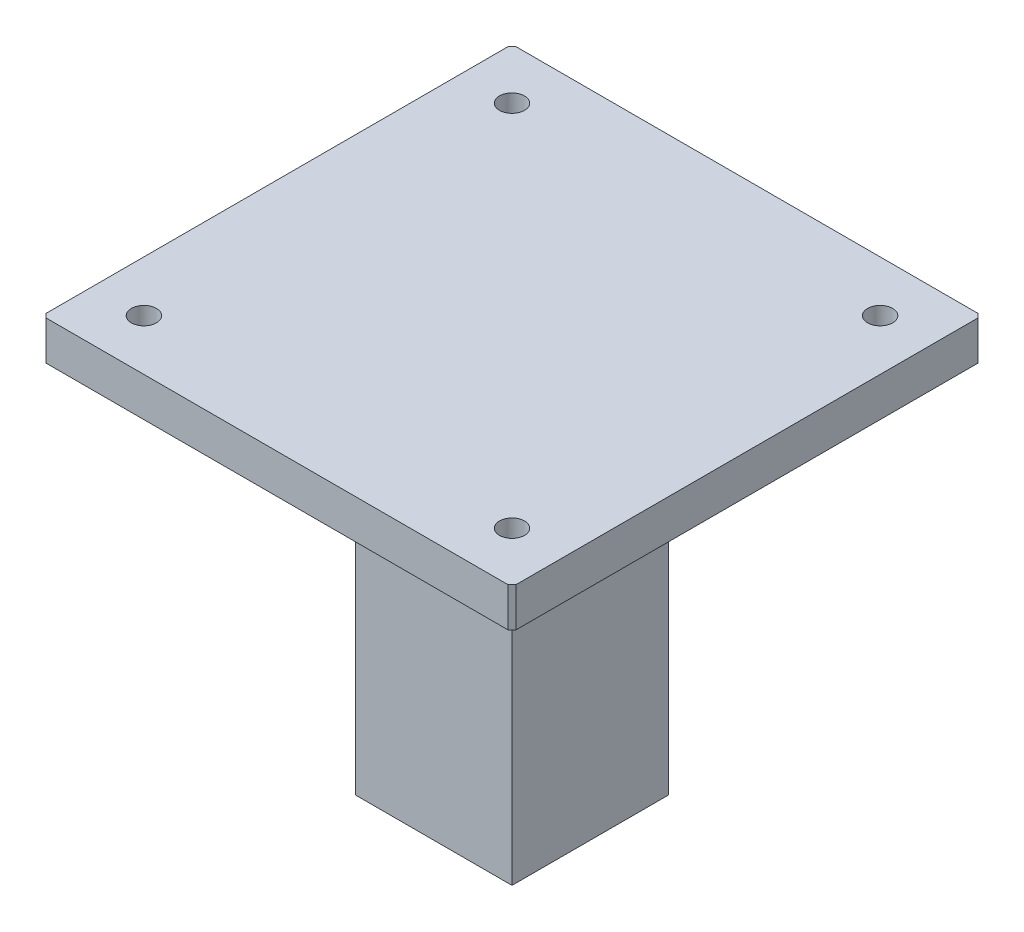
ISO-10303-21;
HEADER;
FILE_DESCRIPTION(('STEP AP214'),'2;1');
FILE_NAME('part.step','',(''),(''),'','','');
FILE_SCHEMA(('AUTOMOTIVE_DESIGN { 1 0 10303 214 1 1 1 1 }'));
ENDSEC;
DATA;
#1=APPLICATION_CONTEXT('core data for automotive mechanical design processes');
#2=APPLICATION_PROTOCOL_DEFINITION('international standard','automotive_design',2000,#1);
#3=PRODUCT_CONTEXT('',#1,'mechanical');
#4=PRODUCT('Part','Part','',(#3));
#5=PRODUCT_RELATED_PRODUCT_CATEGORY('part','',(#4));
#6=PRODUCT_DEFINITION_FORMATION('','',#4);
#7=PRODUCT_DEFINITION_CONTEXT('part definition',#1,'design');
#8=PRODUCT_DEFINITION('design','',#6,#7);
#9=PRODUCT_DEFINITION_SHAPE('','',#8);
#10=(LENGTH_UNIT() NAMED_UNIT(*) SI_UNIT(.MILLI.,.METRE.));
#11=(NAMED_UNIT(*) PLANE_ANGLE_UNIT() SI_UNIT($,.RADIAN.));
#12=(NAMED_UNIT(*) SI_UNIT($,.STERADIAN.) SOLID_ANGLE_UNIT());
#13=UNCERTAINTY_MEASURE_WITH_UNIT(LENGTH_MEASURE(1.E-05),#10,'distance_accuracy_value','');
#14=(GEOMETRIC_REPRESENTATION_CONTEXT(3) GLOBAL_UNCERTAINTY_ASSIGNED_CONTEXT((#13)) GLOBAL_UNIT_ASSIGNED_CONTEXT((#10,
#11,#12)) REPRESENTATION_CONTEXT('',''));
#15=CARTESIAN_POINT('',(0.,0.,0.));
#16=DIRECTION('',(0.,0.,1.));
#17=DIRECTION('',(1.,0.,0.));
#18=AXIS2_PLACEMENT_3D('',#15,#16,#17);
#19=CARTESIAN_POINT('',(0.,0.,0.));
#20=DIRECTION('',(0.,-1.,0.));
#21=DIRECTION('',(0.,0.,-1.));
#22=AXIS2_PLACEMENT_3D('',#19,#20,#21);
#23=PLANE('',#22);
#24=CARTESIAN_POINT('',(1.5,0.,-6.5));
#25=DIRECTION('',(0.,-1.,0.));
#26=DIRECTION('',(0.,0.,-1.));
#27=AXIS2_PLACEMENT_3D('',#24,#25,#26);
#28=CIRCLE('',#27,1.6);
#29=CARTESIAN_POINT('',(1.5,0.,-8.1));
#30=VERTEX_POINT('',#29);
#31=EDGE_CURVE('E190',#30,#30,#28,.T.);
#32=ORIENTED_EDGE('',*,*,#31,.F.);
#33=EDGE_LOOP('',(#32));
#34=FACE_BOUND('',#33,.T.);
#35=CARTESIAN_POINT('',(1.5,0.,-53.5));
#36=DIRECTION('',(0.,-1.,0.));
#37=DIRECTION('',(0.,0.,-1.));
#38=AXIS2_PLACEMENT_3D('',#35,#36,#37);
#39=CIRCLE('',#38,1.6);
#40=CARTESIAN_POINT('',(1.5,0.,-55.1));
#41=VERTEX_POINT('',#40);
#42=EDGE_CURVE('E202',#41,#41,#39,.T.);
#43=ORIENTED_EDGE('',*,*,#42,.F.);
#44=EDGE_LOOP('',(#43));
#45=FACE_BOUND('',#44,.T.);
#46=CARTESIAN_POINT('',(48.5,0.,-53.5));
#47=DIRECTION('',(0.,-1.,0.));
#48=DIRECTION('',(0.,0.,-1.));
#49=AXIS2_PLACEMENT_3D('',#46,#47,#48);
#50=CIRCLE('',#49,1.6);
#51=CARTESIAN_POINT('',(48.5,0.,-55.1));
#52=VERTEX_POINT('',#51);
#53=EDGE_CURVE('E199',#52,#52,#50,.T.);
#54=ORIENTED_EDGE('',*,*,#53,.F.);
#55=EDGE_LOOP('',(#54));
#56=FACE_BOUND('',#55,.T.);
#57=CARTESIAN_POINT('',(48.5,0.,-6.5));
#58=DIRECTION('',(0.,-1.,0.));
#59=DIRECTION('',(0.,0.,-1.));
#60=AXIS2_PLACEMENT_3D('',#57,#58,#59);
#61=CIRCLE('',#60,1.6);
#62=CARTESIAN_POINT('',(48.5,0.,-8.1));
#63=VERTEX_POINT('',#62);
#64=EDGE_CURVE('E172',#63,#63,#61,.T.);
#65=ORIENTED_EDGE('',*,*,#64,.F.);
#66=EDGE_LOOP('',(#65));
#67=FACE_BOUND('',#66,.T.);
#68=DIRECTION('',(1.,0.,0.));
#69=VECTOR('',#68,1.);
#70=CARTESIAN_POINT('',(-5.,0.,0.));
#71=LINE('',#70,#69);
#72=CARTESIAN_POINT('',(-4.49999999999997,0.,0.));
#73=VERTEX_POINT('',#72);
#74=CARTESIAN_POINT('',(54.5,0.,0.));
#75=VERTEX_POINT('',#74);
#76=EDGE_CURVE('E189',#73,#75,#71,.T.);
#77=ORIENTED_EDGE('',*,*,#76,.F.);
#78=DIRECTION('',(0.707106781186548,0.,0.707106781186548));
#79=VECTOR('',#78,1.);
#80=CARTESIAN_POINT('',(-2.24999999999999,0.,2.24999999999999));
#81=LINE('',#80,#79);
#82=CARTESIAN_POINT('',(-5.,0.,-0.500000000000019));
#83=VERTEX_POINT('',#82);
#84=EDGE_CURVE('E217',#73,#83,#81,.F.);
#85=ORIENTED_EDGE('',*,*,#84,.T.);
#86=DIRECTION('',(0.,0.,1.));
#87=VECTOR('',#86,1.);
#88=CARTESIAN_POINT('',(-5.,0.,0.));
#89=LINE('',#88,#87);
#90=CARTESIAN_POINT('',(-5.,0.,-59.5));
#91=VERTEX_POINT('',#90);
#92=EDGE_CURVE('E186',#91,#83,#89,.T.);
#93=ORIENTED_EDGE('',*,*,#92,.F.);
#94=DIRECTION('',(-0.707106781186548,0.,0.707106781186548));
#95=VECTOR('',#94,1.);
#96=CARTESIAN_POINT('',(-32.25,0.,-32.25));
#97=LINE('',#96,#95);
#98=CARTESIAN_POINT('',(-4.49999999999998,0.,-60.));
#99=VERTEX_POINT('',#98);
#100=EDGE_CURVE('E211',#91,#99,#97,.F.);
#101=ORIENTED_EDGE('',*,*,#100,.T.);
#102=DIRECTION('',(-1.,0.,0.));
#103=VECTOR('',#102,1.);
#104=CARTESIAN_POINT('',(-5.,0.,-60.));
#105=LINE('',#104,#103);
#106=CARTESIAN_POINT('',(54.5,0.,-60.));
#107=VERTEX_POINT('',#106);
#108=EDGE_CURVE('E177',#107,#99,#105,.T.);
#109=ORIENTED_EDGE('',*,*,#108,.F.);
#110=DIRECTION('',(-0.707106781186548,0.,-0.707106781186548));
#111=VECTOR('',#110,1.);
#112=CARTESIAN_POINT('',(57.25,0.,-57.25));
#113=LINE('',#112,#111);
#114=CARTESIAN_POINT('',(55.,0.,-59.5));
#115=VERTEX_POINT('',#114);
#116=EDGE_CURVE('E213',#107,#115,#113,.F.);
#117=ORIENTED_EDGE('',*,*,#116,.T.);
#118=DIRECTION('',(0.,0.,-1.));
#119=VECTOR('',#118,1.);
#120=CARTESIAN_POINT('',(55.,0.,0.));
#121=LINE('',#120,#119);
#122=CARTESIAN_POINT('',(55.,0.,-0.499999999999995));
#123=VERTEX_POINT('',#122);
#124=EDGE_CURVE('E193',#123,#115,#121,.T.);
#125=ORIENTED_EDGE('',*,*,#124,.F.);
#126=DIRECTION('',(0.707106781186552,0.,-0.707106781186543));
#127=VECTOR('',#126,1.);
#128=CARTESIAN_POINT('',(27.2499999999996,0.,27.25));
#129=LINE('',#128,#127);
#130=EDGE_CURVE('E215',#123,#75,#129,.F.);
#131=ORIENTED_EDGE('',*,*,#130,.T.);
#132=EDGE_LOOP('',(#77,#85,#93,#101,#109,#117,#125,#131));
#133=FACE_BOUND('',#132,.T.);
#134=DIRECTION('',(1.,0.,0.));
#135=VECTOR('',#134,1.);
#136=CARTESIAN_POINT('',(15.,0.,-40.));
#137=LINE('',#136,#135);
#138=CARTESIAN_POINT('',(15.,0.,-40.));
#139=VERTEX_POINT('',#138);
#140=CARTESIAN_POINT('',(35.,0.,-40.));
#141=VERTEX_POINT('',#140);
#142=EDGE_CURVE('E434',#139,#141,#137,.T.);
#143=ORIENTED_EDGE('',*,*,#142,.F.);
#144=DIRECTION('',(0.,0.,-1.));
#145=VECTOR('',#144,1.);
#146=CARTESIAN_POINT('',(15.,0.,-20.));
#147=LINE('',#146,#145);
#148=CARTESIAN_POINT('',(15.,0.,-20.));
#149=VERTEX_POINT('',#148);
#150=EDGE_CURVE('E154',#149,#139,#147,.T.);
#151=ORIENTED_EDGE('',*,*,#150,.F.);
#152=DIRECTION('',(-1.,0.,0.));
#153=VECTOR('',#152,1.);
#154=CARTESIAN_POINT('',(15.,0.,-20.));
#155=LINE('',#154,#153);
#156=CARTESIAN_POINT('',(35.,0.,-20.));
#157=VERTEX_POINT('',#156);
#158=EDGE_CURVE('E150',#157,#149,#155,.T.);
#159=ORIENTED_EDGE('',*,*,#158,.F.);
#160=DIRECTION('',(0.,0.,1.));
#161=VECTOR('',#160,1.);
#162=CARTESIAN_POINT('',(35.,0.,-20.));
#163=LINE('',#162,#161);
#164=EDGE_CURVE('E431',#141,#157,#163,.T.);
#165=ORIENTED_EDGE('',*,*,#164,.F.);
#166=EDGE_LOOP('',(#143,#151,#159,#165));
#167=FACE_BOUND('',#166,.T.);
#168=ADVANCED_FACE('F40',(#34,#45,#56,#67,#133,#167),#23,.T.);
#169=CARTESIAN_POINT('',(-5.,5.,0.));
#170=DIRECTION('',(1.,0.,0.));
#171=DIRECTION('',(0.,0.,-1.));
#172=AXIS2_PLACEMENT_3D('',#169,#170,#171);
#173=PLANE('',#172);
#174=ORIENTED_EDGE('',*,*,#92,.T.);
#175=DIRECTION('',(0.,1.,0.));
#176=VECTOR('',#175,1.);
#177=CARTESIAN_POINT('',(-5.,5.,-0.500000000000019));
#178=LINE('',#177,#176);
#179=CARTESIAN_POINT('',(-5.,5.,-0.500000000000019));
#180=VERTEX_POINT('',#179);
#181=EDGE_CURVE('E222',#83,#180,#178,.T.);
#182=ORIENTED_EDGE('',*,*,#181,.T.);
#183=DIRECTION('',(0.,0.,1.));
#184=VECTOR('',#183,1.);
#185=CARTESIAN_POINT('',(-5.,5.,0.));
#186=LINE('',#185,#184);
#187=CARTESIAN_POINT('',(-5.,5.,-59.5));
#188=VERTEX_POINT('',#187);
#189=EDGE_CURVE('E173',#188,#180,#186,.T.);
#190=ORIENTED_EDGE('',*,*,#189,.F.);
#191=DIRECTION('',(0.,-1.,0.));
#192=VECTOR('',#191,1.);
#193=CARTESIAN_POINT('',(-5.,5.,-59.5));
#194=LINE('',#193,#192);
#195=EDGE_CURVE('E219',#188,#91,#194,.T.);
#196=ORIENTED_EDGE('',*,*,#195,.T.);
#197=EDGE_LOOP('',(#174,#182,#190,#196));
#198=FACE_BOUND('',#197,.T.);
#199=ADVANCED_FACE('F261',(#198),#173,.F.);
#200=CARTESIAN_POINT('',(-5.,5.,0.));
#201=DIRECTION('',(0.,0.,-1.));
#202=DIRECTION('',(-1.,0.,0.));
#203=AXIS2_PLACEMENT_3D('',#200,#201,#202);
#204=PLANE('',#203);
#205=DIRECTION('',(1.,0.,0.));
#206=VECTOR('',#205,1.);
#207=CARTESIAN_POINT('',(-5.,5.,0.));
#208=LINE('',#207,#206);
#209=CARTESIAN_POINT('',(-4.49999999999997,5.,0.));
#210=VERTEX_POINT('',#209);
#211=CARTESIAN_POINT('',(54.5,5.,0.));
#212=VERTEX_POINT('',#211);
#213=EDGE_CURVE('E176',#210,#212,#208,.T.);
#214=ORIENTED_EDGE('',*,*,#213,.F.);
#215=DIRECTION('',(0.,-1.,0.));
#216=VECTOR('',#215,1.);
#217=CARTESIAN_POINT('',(-4.49999999999997,5.,0.));
#218=LINE('',#217,#216);
#219=EDGE_CURVE('E208',#210,#73,#218,.T.);
#220=ORIENTED_EDGE('',*,*,#219,.T.);
#221=ORIENTED_EDGE('',*,*,#76,.T.);
#222=DIRECTION('',(0.,1.,0.));
#223=VECTOR('',#222,1.);
#224=CARTESIAN_POINT('',(54.5,5.,0.));
#225=LINE('',#224,#223);
#226=EDGE_CURVE('E185',#75,#212,#225,.T.);
#227=ORIENTED_EDGE('',*,*,#226,.T.);
#228=EDGE_LOOP('',(#214,#220,#221,#227));
#229=FACE_BOUND('',#228,.T.);
#230=ADVANCED_FACE('F269',(#229),#204,.F.);
#231=CARTESIAN_POINT('',(55.,5.,0.));
#232=DIRECTION('',(-1.,0.,0.));
#233=DIRECTION('',(0.,0.,1.));
#234=AXIS2_PLACEMENT_3D('',#231,#232,#233);
#235=PLANE('',#234);
#236=DIRECTION('',(0.,0.,-1.));
#237=VECTOR('',#236,1.);
#238=CARTESIAN_POINT('',(55.,5.,0.));
#239=LINE('',#238,#237);
#240=CARTESIAN_POINT('',(55.,5.,-0.499999999999995));
#241=VERTEX_POINT('',#240);
#242=CARTESIAN_POINT('',(55.,5.,-59.5));
#243=VERTEX_POINT('',#242);
#244=EDGE_CURVE('E180',#241,#243,#239,.T.);
#245=ORIENTED_EDGE('',*,*,#244,.F.);
#246=DIRECTION('',(0.,-1.,0.));
#247=VECTOR('',#246,1.);
#248=CARTESIAN_POINT('',(55.,5.,-0.499999999999995));
#249=LINE('',#248,#247);
#250=EDGE_CURVE('E234',#241,#123,#249,.T.);
#251=ORIENTED_EDGE('',*,*,#250,.T.);
#252=ORIENTED_EDGE('',*,*,#124,.T.);
#253=DIRECTION('',(0.,1.,0.));
#254=VECTOR('',#253,1.);
#255=CARTESIAN_POINT('',(55.,5.,-59.5));
#256=LINE('',#255,#254);
#257=EDGE_CURVE('E232',#115,#243,#256,.T.);
#258=ORIENTED_EDGE('',*,*,#257,.T.);
#259=EDGE_LOOP('',(#245,#251,#252,#258));
#260=FACE_BOUND('',#259,.T.);
#261=ADVANCED_FACE('F240',(#260),#235,.F.);
#262=CARTESIAN_POINT('',(-5.,5.,-60.));
#263=DIRECTION('',(0.,0.,1.));
#264=DIRECTION('',(1.,0.,0.));
#265=AXIS2_PLACEMENT_3D('',#262,#263,#264);
#266=PLANE('',#265);
#267=DIRECTION('',(-1.,0.,0.));
#268=VECTOR('',#267,1.);
#269=CARTESIAN_POINT('',(-5.,5.,-60.));
#270=LINE('',#269,#268);
#271=CARTESIAN_POINT('',(54.5,5.,-60.));
#272=VERTEX_POINT('',#271);
#273=CARTESIAN_POINT('',(-4.49999999999998,5.,-60.));
#274=VERTEX_POINT('',#273);
#275=EDGE_CURVE('E183',#272,#274,#270,.T.);
#276=ORIENTED_EDGE('',*,*,#275,.F.);
#277=DIRECTION('',(0.,-1.,0.));
#278=VECTOR('',#277,1.);
#279=CARTESIAN_POINT('',(54.5,5.,-60.));
#280=LINE('',#279,#278);
#281=EDGE_CURVE('E11',#272,#107,#280,.T.);
#282=ORIENTED_EDGE('',*,*,#281,.T.);
#283=ORIENTED_EDGE('',*,*,#108,.T.);
#284=DIRECTION('',(0.,1.,0.));
#285=VECTOR('',#284,1.);
#286=CARTESIAN_POINT('',(-4.49999999999998,5.,-60.));
#287=LINE('',#286,#285);
#288=EDGE_CURVE('E49',#99,#274,#287,.T.);
#289=ORIENTED_EDGE('',*,*,#288,.T.);
#290=EDGE_LOOP('',(#276,#282,#283,#289));
#291=FACE_BOUND('',#290,.T.);
#292=ADVANCED_FACE('F252',(#291),#266,.F.);
#293=CARTESIAN_POINT('',(0.,5.,0.));
#294=DIRECTION('',(0.,-1.,0.));
#295=DIRECTION('',(0.,0.,-1.));
#296=AXIS2_PLACEMENT_3D('',#293,#294,#295);
#297=PLANE('',#296);
#298=CARTESIAN_POINT('',(1.5,5.,-6.5));
#299=DIRECTION('',(0.,1.,0.));
#300=DIRECTION('',(0.,0.,1.));
#301=AXIS2_PLACEMENT_3D('',#298,#299,#300);
#302=CIRCLE('',#301,1.6);
#303=CARTESIAN_POINT('',(1.5,5.,-4.9));
#304=VERTEX_POINT('',#303);
#305=EDGE_CURVE('E156',#304,#304,#302,.T.);
#306=ORIENTED_EDGE('',*,*,#305,.F.);
#307=EDGE_LOOP('',(#306));
#308=FACE_BOUND('',#307,.T.);
#309=CARTESIAN_POINT('',(1.5,5.,-53.5));
#310=DIRECTION('',(0.,1.,0.));
#311=DIRECTION('',(0.,0.,1.));
#312=AXIS2_PLACEMENT_3D('',#309,#310,#311);
#313=CIRCLE('',#312,1.6);
#314=CARTESIAN_POINT('',(1.5,5.,-51.9));
#315=VERTEX_POINT('',#314);
#316=EDGE_CURVE('E159',#315,#315,#313,.T.);
#317=ORIENTED_EDGE('',*,*,#316,.F.);
#318=EDGE_LOOP('',(#317));
#319=FACE_BOUND('',#318,.T.);
#320=CARTESIAN_POINT('',(48.5,5.,-53.5));
#321=DIRECTION('',(0.,1.,0.));
#322=DIRECTION('',(0.,0.,1.));
#323=AXIS2_PLACEMENT_3D('',#320,#321,#322);
#324=CIRCLE('',#323,1.6);
#325=CARTESIAN_POINT('',(48.5,5.,-51.9));
#326=VERTEX_POINT('',#325);
#327=EDGE_CURVE('E164',#326,#326,#324,.T.);
#328=ORIENTED_EDGE('',*,*,#327,.F.);
#329=EDGE_LOOP('',(#328));
#330=FACE_BOUND('',#329,.T.);
#331=CARTESIAN_POINT('',(48.5,5.,-6.5));
#332=DIRECTION('',(0.,1.,0.));
#333=DIRECTION('',(0.,0.,1.));
#334=AXIS2_PLACEMENT_3D('',#331,#332,#333);
#335=CIRCLE('',#334,1.6);
#336=CARTESIAN_POINT('',(48.5,5.,-4.9));
#337=VERTEX_POINT('',#336);
#338=EDGE_CURVE('E167',#337,#337,#335,.T.);
#339=ORIENTED_EDGE('',*,*,#338,.F.);
#340=EDGE_LOOP('',(#339));
#341=FACE_BOUND('',#340,.T.);
#342=ORIENTED_EDGE('',*,*,#189,.T.);
#343=DIRECTION('',(-0.707106781186548,0.,-0.707106781186548));
#344=VECTOR('',#343,1.);
#345=CARTESIAN_POINT('',(-4.49999999999997,5.,0.));
#346=LINE('',#345,#344);
#347=EDGE_CURVE('E230',#180,#210,#346,.F.);
#348=ORIENTED_EDGE('',*,*,#347,.T.);
#349=ORIENTED_EDGE('',*,*,#213,.T.);
#350=DIRECTION('',(-0.707106781186552,0.,0.707106781186543));
#351=VECTOR('',#350,1.);
#352=CARTESIAN_POINT('',(55.,5.,-0.499999999999995));
#353=LINE('',#352,#351);
#354=EDGE_CURVE('E228',#212,#241,#353,.F.);
#355=ORIENTED_EDGE('',*,*,#354,.T.);
#356=ORIENTED_EDGE('',*,*,#244,.T.);
#357=DIRECTION('',(0.707106781186548,0.,0.707106781186548));
#358=VECTOR('',#357,1.);
#359=CARTESIAN_POINT('',(54.5,5.,-60.));
#360=LINE('',#359,#358);
#361=EDGE_CURVE('E226',#243,#272,#360,.F.);
#362=ORIENTED_EDGE('',*,*,#361,.T.);
#363=ORIENTED_EDGE('',*,*,#275,.T.);
#364=DIRECTION('',(0.707106781186548,0.,-0.707106781186548));
#365=VECTOR('',#364,1.);
#366=CARTESIAN_POINT('',(-5.,5.,-59.5));
#367=LINE('',#366,#365);
#368=EDGE_CURVE('E224',#274,#188,#367,.F.);
#369=ORIENTED_EDGE('',*,*,#368,.T.);
#370=EDGE_LOOP('',(#342,#348,#349,#355,#356,#362,#363,#369));
#371=FACE_BOUND('',#370,.T.);
#372=ADVANCED_FACE('F255',(#308,#319,#330,#341,#371),#297,.F.);
#373=CARTESIAN_POINT('',(48.5,-5.,-6.5));
#374=DIRECTION('',(0.,1.,0.));
#375=DIRECTION('',(0.,0.,1.));
#376=AXIS2_PLACEMENT_3D('',#373,#374,#375);
#377=CYLINDRICAL_SURFACE('',#376,1.6);
#378=ORIENTED_EDGE('',*,*,#64,.T.);
#379=EDGE_LOOP('',(#378));
#380=FACE_BOUND('',#379,.T.);
#381=ORIENTED_EDGE('',*,*,#338,.T.);
#382=EDGE_LOOP('',(#381));
#383=FACE_BOUND('',#382,.T.);
#384=ADVANCED_FACE('F326',(#380,#383),#377,.F.);
#385=CARTESIAN_POINT('',(48.5,-5.,-53.5));
#386=DIRECTION('',(0.,1.,0.));
#387=DIRECTION('',(0.,0.,1.));
#388=AXIS2_PLACEMENT_3D('',#385,#386,#387);
#389=CYLINDRICAL_SURFACE('',#388,1.6);
#390=ORIENTED_EDGE('',*,*,#53,.T.);
#391=EDGE_LOOP('',(#390));
#392=FACE_BOUND('',#391,.T.);
#393=ORIENTED_EDGE('',*,*,#327,.T.);
#394=EDGE_LOOP('',(#393));
#395=FACE_BOUND('',#394,.T.);
#396=ADVANCED_FACE('F334',(#392,#395),#389,.F.);
#397=CARTESIAN_POINT('',(1.5,-5.,-53.5));
#398=DIRECTION('',(0.,1.,0.));
#399=DIRECTION('',(0.,0.,1.));
#400=AXIS2_PLACEMENT_3D('',#397,#398,#399);
#401=CYLINDRICAL_SURFACE('',#400,1.6);
#402=ORIENTED_EDGE('',*,*,#42,.T.);
#403=EDGE_LOOP('',(#402));
#404=FACE_BOUND('',#403,.T.);
#405=ORIENTED_EDGE('',*,*,#316,.T.);
#406=EDGE_LOOP('',(#405));
#407=FACE_BOUND('',#406,.T.);
#408=ADVANCED_FACE('F341',(#404,#407),#401,.F.);
#409=CARTESIAN_POINT('',(1.5,-5.,-6.5));
#410=DIRECTION('',(0.,1.,0.));
#411=DIRECTION('',(0.,0.,1.));
#412=AXIS2_PLACEMENT_3D('',#409,#410,#411);
#413=CYLINDRICAL_SURFACE('',#412,1.6);
#414=ORIENTED_EDGE('',*,*,#31,.T.);
#415=EDGE_LOOP('',(#414));
#416=FACE_BOUND('',#415,.T.);
#417=ORIENTED_EDGE('',*,*,#305,.T.);
#418=EDGE_LOOP('',(#417));
#419=FACE_BOUND('',#418,.T.);
#420=ADVANCED_FACE('F278',(#416,#419),#413,.F.);
#421=CARTESIAN_POINT('',(-4.49999999999997,5.,0.));
#422=DIRECTION('',(0.707106781186547,0.,-0.707106781186547));
#423=DIRECTION('',(0.,-1.,0.));
#424=AXIS2_PLACEMENT_3D('',#421,#422,#423);
#425=PLANE('',#424);
#426=ORIENTED_EDGE('',*,*,#347,.F.);
#427=ORIENTED_EDGE('',*,*,#181,.F.);
#428=ORIENTED_EDGE('',*,*,#84,.F.);
#429=ORIENTED_EDGE('',*,*,#219,.F.);
#430=EDGE_LOOP('',(#426,#427,#428,#429));
#431=FACE_BOUND('',#430,.T.);
#432=ADVANCED_FACE('F266',(#431),#425,.F.);
#433=CARTESIAN_POINT('',(55.,5.,-0.499999999999995));
#434=DIRECTION('',(-0.707106781186543,0.,-0.707106781186552));
#435=DIRECTION('',(0.,-1.,0.));
#436=AXIS2_PLACEMENT_3D('',#433,#434,#435);
#437=PLANE('',#436);
#438=ORIENTED_EDGE('',*,*,#354,.F.);
#439=ORIENTED_EDGE('',*,*,#226,.F.);
#440=ORIENTED_EDGE('',*,*,#130,.F.);
#441=ORIENTED_EDGE('',*,*,#250,.F.);
#442=EDGE_LOOP('',(#438,#439,#440,#441));
#443=FACE_BOUND('',#442,.T.);
#444=ADVANCED_FACE('F271',(#443),#437,.F.);
#445=CARTESIAN_POINT('',(54.5,5.,-60.));
#446=DIRECTION('',(-0.707106781186547,0.,0.707106781186547));
#447=DIRECTION('',(0.,-1.,0.));
#448=AXIS2_PLACEMENT_3D('',#445,#446,#447);
#449=PLANE('',#448);
#450=ORIENTED_EDGE('',*,*,#361,.F.);
#451=ORIENTED_EDGE('',*,*,#257,.F.);
#452=ORIENTED_EDGE('',*,*,#116,.F.);
#453=ORIENTED_EDGE('',*,*,#281,.F.);
#454=EDGE_LOOP('',(#450,#451,#452,#453));
#455=FACE_BOUND('',#454,.T.);
#456=ADVANCED_FACE('F251',(#455),#449,.F.);
#457=CARTESIAN_POINT('',(-5.,5.,-59.5));
#458=DIRECTION('',(0.707106781186547,0.,0.707106781186547));
#459=DIRECTION('',(0.,-1.,0.));
#460=AXIS2_PLACEMENT_3D('',#457,#458,#459);
#461=PLANE('',#460);
#462=ORIENTED_EDGE('',*,*,#368,.F.);
#463=ORIENTED_EDGE('',*,*,#288,.F.);
#464=ORIENTED_EDGE('',*,*,#100,.F.);
#465=ORIENTED_EDGE('',*,*,#195,.F.);
#466=EDGE_LOOP('',(#462,#463,#464,#465));
#467=FACE_BOUND('',#466,.T.);
#468=ADVANCED_FACE('F43',(#467),#461,.F.);
#469=CARTESIAN_POINT('',(15.,-48.,-20.));
#470=DIRECTION('',(1.,0.,0.));
#471=DIRECTION('',(0.,0.,-1.));
#472=AXIS2_PLACEMENT_3D('',#469,#470,#471);
#473=PLANE('',#472);
#474=ORIENTED_EDGE('',*,*,#150,.T.);
#475=DIRECTION('',(0.,1.,0.));
#476=VECTOR('',#475,1.);
#477=CARTESIAN_POINT('',(15.,-48.,-40.));
#478=LINE('',#477,#476);
#479=CARTESIAN_POINT('',(15.,-48.,-40.));
#480=VERTEX_POINT('',#479);
#481=EDGE_CURVE('E135',#480,#139,#478,.T.);
#482=ORIENTED_EDGE('',*,*,#481,.F.);
#483=DIRECTION('',(0.,0.,-1.));
#484=VECTOR('',#483,1.);
#485=CARTESIAN_POINT('',(15.,-48.,-20.));
#486=LINE('',#485,#484);
#487=CARTESIAN_POINT('',(15.,-48.,-20.));
#488=VERTEX_POINT('',#487);
#489=EDGE_CURVE('E142',#488,#480,#486,.T.);
#490=ORIENTED_EDGE('',*,*,#489,.F.);
#491=DIRECTION('',(0.,1.,0.));
#492=VECTOR('',#491,1.);
#493=CARTESIAN_POINT('',(15.,-48.,-20.));
#494=LINE('',#493,#492);
#495=EDGE_CURVE('E429',#488,#149,#494,.T.);
#496=ORIENTED_EDGE('',*,*,#495,.T.);
#497=EDGE_LOOP('',(#474,#482,#490,#496));
#498=FACE_BOUND('',#497,.T.);
#499=ADVANCED_FACE('F152',(#498),#473,.F.);
#500=CARTESIAN_POINT('',(15.,-48.,-40.));
#501=DIRECTION('',(0.,0.,1.));
#502=DIRECTION('',(1.,0.,0.));
#503=AXIS2_PLACEMENT_3D('',#500,#501,#502);
#504=PLANE('',#503);
#505=ORIENTED_EDGE('',*,*,#142,.T.);
#506=DIRECTION('',(0.,1.,0.));
#507=VECTOR('',#506,1.);
#508=CARTESIAN_POINT('',(35.,-48.,-40.));
#509=LINE('',#508,#507);
#510=CARTESIAN_POINT('',(35.,-48.,-40.));
#511=VERTEX_POINT('',#510);
#512=EDGE_CURVE('E138',#511,#141,#509,.T.);
#513=ORIENTED_EDGE('',*,*,#512,.F.);
#514=DIRECTION('',(1.,0.,0.));
#515=VECTOR('',#514,1.);
#516=CARTESIAN_POINT('',(15.,-48.,-40.));
#517=LINE('',#516,#515);
#518=EDGE_CURVE('E131',#480,#511,#517,.T.);
#519=ORIENTED_EDGE('',*,*,#518,.F.);
#520=ORIENTED_EDGE('',*,*,#481,.T.);
#521=EDGE_LOOP('',(#505,#513,#519,#520));
#522=FACE_BOUND('',#521,.T.);
#523=ADVANCED_FACE('F133',(#522),#504,.F.);
#524=CARTESIAN_POINT('',(35.,-48.,-20.));
#525=DIRECTION('',(-1.,0.,0.));
#526=DIRECTION('',(0.,0.,1.));
#527=AXIS2_PLACEMENT_3D('',#524,#525,#526);
#528=PLANE('',#527);
#529=ORIENTED_EDGE('',*,*,#164,.T.);
#530=DIRECTION('',(0.,1.,0.));
#531=VECTOR('',#530,1.);
#532=CARTESIAN_POINT('',(35.,-48.,-20.));
#533=LINE('',#532,#531);
#534=CARTESIAN_POINT('',(35.,-48.,-20.));
#535=VERTEX_POINT('',#534);
#536=EDGE_CURVE('E56',#535,#157,#533,.T.);
#537=ORIENTED_EDGE('',*,*,#536,.F.);
#538=DIRECTION('',(0.,0.,1.));
#539=VECTOR('',#538,1.);
#540=CARTESIAN_POINT('',(35.,-48.,-20.));
#541=LINE('',#540,#539);
#542=EDGE_CURVE('E141',#511,#535,#541,.T.);
#543=ORIENTED_EDGE('',*,*,#542,.F.);
#544=ORIENTED_EDGE('',*,*,#512,.T.);
#545=EDGE_LOOP('',(#529,#537,#543,#544));
#546=FACE_BOUND('',#545,.T.);
#547=ADVANCED_FACE('F398',(#546),#528,.F.);
#548=CARTESIAN_POINT('',(15.,-48.,-20.));
#549=DIRECTION('',(0.,0.,-1.));
#550=DIRECTION('',(-1.,0.,0.));
#551=AXIS2_PLACEMENT_3D('',#548,#549,#550);
#552=PLANE('',#551);
#553=ORIENTED_EDGE('',*,*,#158,.T.);
#554=ORIENTED_EDGE('',*,*,#495,.F.);
#555=DIRECTION('',(-1.,0.,0.));
#556=VECTOR('',#555,1.);
#557=CARTESIAN_POINT('',(15.,-48.,-20.));
#558=LINE('',#557,#556);
#559=EDGE_CURVE('E146',#535,#488,#558,.T.);
#560=ORIENTED_EDGE('',*,*,#559,.F.);
#561=ORIENTED_EDGE('',*,*,#536,.T.);
#562=EDGE_LOOP('',(#553,#554,#560,#561));
#563=FACE_BOUND('',#562,.T.);
#564=ADVANCED_FACE('F407',(#563),#552,.F.);
#565=CARTESIAN_POINT('',(0.,-48.,0.));
#566=DIRECTION('',(0.,-1.,0.));
#567=DIRECTION('',(0.,0.,-1.));
#568=AXIS2_PLACEMENT_3D('',#565,#566,#567);
#569=PLANE('',#568);
#570=ORIENTED_EDGE('',*,*,#489,.T.);
#571=ORIENTED_EDGE('',*,*,#518,.T.);
#572=ORIENTED_EDGE('',*,*,#542,.T.);
#573=ORIENTED_EDGE('',*,*,#559,.T.);
#574=EDGE_LOOP('',(#570,#571,#572,#573));
#575=FACE_BOUND('',#574,.T.);
#576=ADVANCED_FACE('F145',(#575),#569,.T.);
#577=CLOSED_SHELL('',(#168,#199,#230,#261,#292,#372,#384,#396,#408,#420,#432,#444,#456,#468,
#499,#523,#547,#564,#576));
#578=MANIFOLD_SOLID_BREP('B2',#577);
#579=ADVANCED_BREP_SHAPE_REPRESENTATION('',(#18,#578),#14);
#580=SHAPE_DEFINITION_REPRESENTATION(#9,#579);
ENDSEC;
END-ISO-10303-21;
